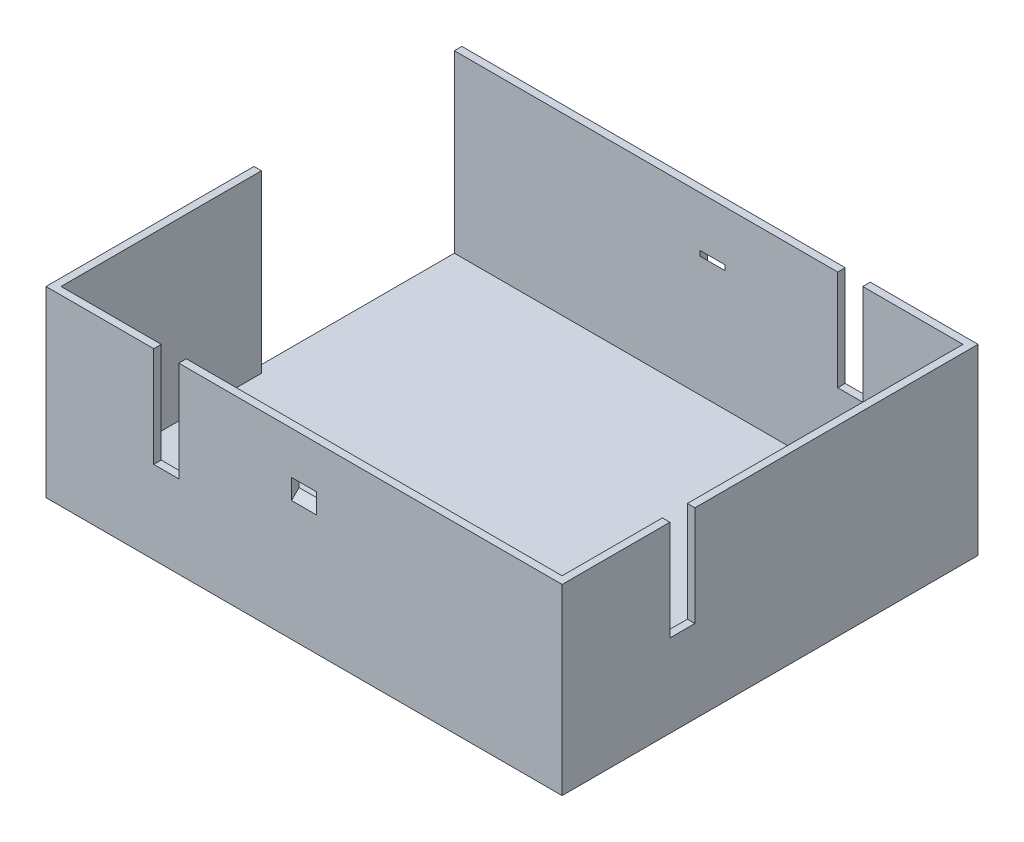
ISO-10303-21;
HEADER;
FILE_DESCRIPTION(('STEP AP214'),'2;1');
FILE_NAME('part.step','',(''),(''),'','','');
FILE_SCHEMA(('AUTOMOTIVE_DESIGN { 1 0 10303 214 1 1 1 1 }'));
ENDSEC;
DATA;
#1=APPLICATION_CONTEXT('core data for automotive mechanical design processes');
#2=APPLICATION_PROTOCOL_DEFINITION('international standard','automotive_design',2000,#1);
#3=PRODUCT_CONTEXT('',#1,'mechanical');
#4=PRODUCT('Part','Part','',(#3));
#5=PRODUCT_RELATED_PRODUCT_CATEGORY('part','',(#4));
#6=PRODUCT_DEFINITION_FORMATION('','',#4);
#7=PRODUCT_DEFINITION_CONTEXT('part definition',#1,'design');
#8=PRODUCT_DEFINITION('design','',#6,#7);
#9=PRODUCT_DEFINITION_SHAPE('','',#8);
#10=(LENGTH_UNIT() NAMED_UNIT(*) SI_UNIT(.MILLI.,.METRE.));
#11=(NAMED_UNIT(*) PLANE_ANGLE_UNIT() SI_UNIT($,.RADIAN.));
#12=(NAMED_UNIT(*) SI_UNIT($,.STERADIAN.) SOLID_ANGLE_UNIT());
#13=UNCERTAINTY_MEASURE_WITH_UNIT(LENGTH_MEASURE(1.E-05),#10,'distance_accuracy_value','');
#14=(GEOMETRIC_REPRESENTATION_CONTEXT(3) GLOBAL_UNCERTAINTY_ASSIGNED_CONTEXT((#13)) GLOBAL_UNIT_ASSIGNED_CONTEXT((#10,
#11,#12)) REPRESENTATION_CONTEXT('',''));
#15=CARTESIAN_POINT('',(0.,0.,0.));
#16=DIRECTION('',(0.,0.,1.));
#17=DIRECTION('',(1.,0.,0.));
#18=AXIS2_PLACEMENT_3D('',#15,#16,#17);
#19=CARTESIAN_POINT('',(0.,36.5,0.));
#20=DIRECTION('',(0.,1.,0.));
#21=DIRECTION('',(0.,0.,1.));
#22=AXIS2_PLACEMENT_3D('',#19,#20,#21);
#23=PLANE('',#22);
#24=DIRECTION('',(0.,0.,-1.));
#25=VECTOR('',#24,1.);
#26=CARTESIAN_POINT('',(53.0283018867924,36.5,0.));
#27=LINE('',#26,#25);
#28=CARTESIAN_POINT('',(53.0283018867924,36.5,-10.1745283018868));
#29=VERTEX_POINT('',#28);
#30=CARTESIAN_POINT('',(53.0283018867924,36.5,-11.6745283018868));
#31=VERTEX_POINT('',#30);
#32=EDGE_CURVE('E40',#29,#31,#27,.T.);
#33=ORIENTED_EDGE('',*,*,#32,.F.);
#34=DIRECTION('',(-1.,0.,0.));
#35=VECTOR('',#34,1.);
#36=CARTESIAN_POINT('',(-26.9716981132075,36.5,-10.1745283018868));
#37=LINE('',#36,#35);
#38=CARTESIAN_POINT('',(73.0283018867924,36.5,-10.1745283018868));
#39=VERTEX_POINT('',#38);
#40=EDGE_CURVE('E395',#39,#29,#37,.T.);
#41=ORIENTED_EDGE('',*,*,#40,.F.);
#42=DIRECTION('',(0.,0.,-1.));
#43=VECTOR('',#42,1.);
#44=CARTESIAN_POINT('',(73.0283018867924,36.5,-10.1745283018868));
#45=LINE('',#44,#43);
#46=CARTESIAN_POINT('',(73.0283018867924,36.5,44.8254716981132));
#47=VERTEX_POINT('',#46);
#48=EDGE_CURVE('E405',#47,#39,#45,.T.);
#49=ORIENTED_EDGE('',*,*,#48,.F.);
#50=DIRECTION('',(1.,0.,0.));
#51=VECTOR('',#50,1.);
#52=CARTESIAN_POINT('',(73.0283018867924,36.5,44.8254716981132));
#53=LINE('',#52,#51);
#54=CARTESIAN_POINT('',(74.5283018867924,36.5,44.8254716981132));
#55=VERTEX_POINT('',#54);
#56=EDGE_CURVE('E347',#47,#55,#53,.T.);
#57=ORIENTED_EDGE('',*,*,#56,.T.);
#58=DIRECTION('',(0.,0.,-1.));
#59=VECTOR('',#58,1.);
#60=CARTESIAN_POINT('',(74.5283018867924,36.5,-11.6745283018868));
#61=LINE('',#60,#59);
#62=CARTESIAN_POINT('',(74.5283018867924,36.5,-11.6745283018868));
#63=VERTEX_POINT('',#62);
#64=EDGE_CURVE('E433',#55,#63,#61,.T.);
#65=ORIENTED_EDGE('',*,*,#64,.T.);
#66=DIRECTION('',(-1.,0.,0.));
#67=VECTOR('',#66,1.);
#68=CARTESIAN_POINT('',(-28.4716981132075,36.5,-11.6745283018868));
#69=LINE('',#68,#67);
#70=EDGE_CURVE('E438',#63,#31,#69,.T.);
#71=ORIENTED_EDGE('',*,*,#70,.T.);
#72=EDGE_LOOP('',(#33,#41,#49,#57,#65,#71));
#73=FACE_BOUND('',#72,.T.);
#74=ADVANCED_FACE('F32',(#73),#23,.T.);
#75=CARTESIAN_POINT('',(-28.4716981132075,1.5,-11.6745283018868));
#76=DIRECTION('',(0.,0.,1.));
#77=DIRECTION('',(1.,0.,0.));
#78=AXIS2_PLACEMENT_3D('',#75,#76,#77);
#79=PLANE('',#78);
#80=DIRECTION('',(-1.,0.,0.));
#81=VECTOR('',#80,1.);
#82=CARTESIAN_POINT('',(53.0283018867924,16.5,-11.6745283018868));
#83=LINE('',#82,#81);
#84=CARTESIAN_POINT('',(53.0283018867924,16.5,-11.6745283018868));
#85=VERTEX_POINT('',#84);
#86=CARTESIAN_POINT('',(48.0283018867925,16.5,-11.6745283018868));
#87=VERTEX_POINT('',#86);
#88=EDGE_CURVE('E234',#85,#87,#83,.T.);
#89=ORIENTED_EDGE('',*,*,#88,.F.);
#90=DIRECTION('',(0.,-1.,0.));
#91=VECTOR('',#90,1.);
#92=CARTESIAN_POINT('',(53.0283018867924,36.5,-11.6745283018868));
#93=LINE('',#92,#91);
#94=EDGE_CURVE('E241',#31,#85,#93,.T.);
#95=ORIENTED_EDGE('',*,*,#94,.F.);
#96=ORIENTED_EDGE('',*,*,#70,.F.);
#97=DIRECTION('',(0.,-1.,0.));
#98=VECTOR('',#97,1.);
#99=CARTESIAN_POINT('',(74.5283018867924,1.5,-11.6745283018868));
#100=LINE('',#99,#98);
#101=CARTESIAN_POINT('',(74.5283018867924,0.,-11.6745283018868));
#102=VERTEX_POINT('',#101);
#103=EDGE_CURVE('E452',#63,#102,#100,.T.);
#104=ORIENTED_EDGE('',*,*,#103,.T.);
#105=DIRECTION('',(-1.,0.,0.));
#106=VECTOR('',#105,1.);
#107=CARTESIAN_POINT('',(-28.4716981132075,0.,-11.6745283018868));
#108=LINE('',#107,#106);
#109=CARTESIAN_POINT('',(-28.4716981132075,0.,-11.6745283018868));
#110=VERTEX_POINT('',#109);
#111=EDGE_CURVE('E447',#102,#110,#108,.T.);
#112=ORIENTED_EDGE('',*,*,#111,.T.);
#113=DIRECTION('',(0.,-1.,0.));
#114=VECTOR('',#113,1.);
#115=CARTESIAN_POINT('',(-28.4716981132075,1.5,-11.6745283018868));
#116=LINE('',#115,#114);
#117=CARTESIAN_POINT('',(-28.4716981132075,36.5,-11.6745283018868));
#118=VERTEX_POINT('',#117);
#119=EDGE_CURVE('E449',#118,#110,#116,.T.);
#120=ORIENTED_EDGE('',*,*,#119,.F.);
#121=CARTESIAN_POINT('',(48.0283018867924,36.5,-11.6745283018868));
#122=VERTEX_POINT('',#121);
#123=EDGE_CURVE('E437',#122,#118,#69,.T.);
#124=ORIENTED_EDGE('',*,*,#123,.F.);
#125=DIRECTION('',(0.,1.,0.));
#126=VECTOR('',#125,1.);
#127=CARTESIAN_POINT('',(48.0283018867924,36.5,-11.6745283018868));
#128=LINE('',#127,#126);
#129=EDGE_CURVE('E47',#87,#122,#128,.T.);
#130=ORIENTED_EDGE('',*,*,#129,.F.);
#131=EDGE_LOOP('',(#89,#95,#96,#104,#112,#120,#124,#130));
#132=FACE_BOUND('',#131,.T.);
#133=DIRECTION('',(0.,1.,0.));
#134=VECTOR('',#133,1.);
#135=CARTESIAN_POINT('',(20.5283018867925,28.,-11.6745283018868));
#136=LINE('',#135,#134);
#137=CARTESIAN_POINT('',(20.5283018867925,24.,-11.6745283018868));
#138=VERTEX_POINT('',#137);
#139=CARTESIAN_POINT('',(20.5283018867925,28.,-11.6745283018868));
#140=VERTEX_POINT('',#139);
#141=EDGE_CURVE('E269',#138,#140,#136,.T.);
#142=ORIENTED_EDGE('',*,*,#141,.F.);
#143=DIRECTION('',(1.,0.,0.));
#144=VECTOR('',#143,1.);
#145=CARTESIAN_POINT('',(20.5283018867925,24.,-11.6745283018868));
#146=LINE('',#145,#144);
#147=CARTESIAN_POINT('',(25.5283018867925,24.,-11.6745283018868));
#148=VERTEX_POINT('',#147);
#149=EDGE_CURVE('E284',#138,#148,#146,.T.);
#150=ORIENTED_EDGE('',*,*,#149,.T.);
#151=DIRECTION('',(0.,1.,0.));
#152=VECTOR('',#151,1.);
#153=CARTESIAN_POINT('',(25.5283018867925,28.,-11.6745283018868));
#154=LINE('',#153,#152);
#155=CARTESIAN_POINT('',(25.5283018867924,28.,-11.6745283018868));
#156=VERTEX_POINT('',#155);
#157=EDGE_CURVE('E263',#148,#156,#154,.T.);
#158=ORIENTED_EDGE('',*,*,#157,.T.);
#159=DIRECTION('',(1.,0.,0.));
#160=VECTOR('',#159,1.);
#161=CARTESIAN_POINT('',(20.5283018867925,28.,-11.6745283018868));
#162=LINE('',#161,#160);
#163=EDGE_CURVE('E281',#140,#156,#162,.T.);
#164=ORIENTED_EDGE('',*,*,#163,.F.);
#165=EDGE_LOOP('',(#142,#150,#158,#164));
#166=FACE_BOUND('',#165,.T.);
#167=ADVANCED_FACE('F248',(#132,#166),#79,.F.);
#168=CARTESIAN_POINT('',(-26.9716981132075,36.5,-10.1745283018868));
#169=DIRECTION('',(0.,0.,1.));
#170=DIRECTION('',(1.,0.,0.));
#171=AXIS2_PLACEMENT_3D('',#168,#169,#170);
#172=PLANE('',#171);
#173=DIRECTION('',(0.,1.,0.));
#174=VECTOR('',#173,1.);
#175=CARTESIAN_POINT('',(53.0283018867924,36.5,-10.1745283018868));
#176=LINE('',#175,#174);
#177=CARTESIAN_POINT('',(53.0283018867924,16.5,-10.1745283018868));
#178=VERTEX_POINT('',#177);
#179=EDGE_CURVE('E257',#178,#29,#176,.T.);
#180=ORIENTED_EDGE('',*,*,#179,.F.);
#181=DIRECTION('',(1.,0.,0.));
#182=VECTOR('',#181,1.);
#183=CARTESIAN_POINT('',(-26.9716981132075,16.5,-10.1745283018868));
#184=LINE('',#183,#182);
#185=CARTESIAN_POINT('',(48.0283018867925,16.5,-10.1745283018868));
#186=VERTEX_POINT('',#185);
#187=EDGE_CURVE('E11',#186,#178,#184,.T.);
#188=ORIENTED_EDGE('',*,*,#187,.F.);
#189=DIRECTION('',(0.,-1.,0.));
#190=VECTOR('',#189,1.);
#191=CARTESIAN_POINT('',(48.0283018867924,36.5,-10.1745283018868));
#192=LINE('',#191,#190);
#193=CARTESIAN_POINT('',(48.0283018867924,36.5,-10.1745283018868));
#194=VERTEX_POINT('',#193);
#195=EDGE_CURVE('E254',#194,#186,#192,.T.);
#196=ORIENTED_EDGE('',*,*,#195,.F.);
#197=CARTESIAN_POINT('',(-28.4716981132075,36.5,-10.1745283018868));
#198=VERTEX_POINT('',#197);
#199=EDGE_CURVE('E399',#194,#198,#37,.T.);
#200=ORIENTED_EDGE('',*,*,#199,.T.);
#201=DIRECTION('',(0.,-1.,0.));
#202=VECTOR('',#201,1.);
#203=CARTESIAN_POINT('',(-28.4716981132075,36.5,-10.1745283018868));
#204=LINE('',#203,#202);
#205=CARTESIAN_POINT('',(-28.4716981132075,1.5,-10.1745283018868));
#206=VERTEX_POINT('',#205);
#207=EDGE_CURVE('E372',#198,#206,#204,.T.);
#208=ORIENTED_EDGE('',*,*,#207,.T.);
#209=DIRECTION('',(-1.,0.,0.));
#210=VECTOR('',#209,1.);
#211=CARTESIAN_POINT('',(-26.9716981132075,1.5,-10.1745283018868));
#212=LINE('',#211,#210);
#213=CARTESIAN_POINT('',(73.0283018867924,1.5,-10.1745283018868));
#214=VERTEX_POINT('',#213);
#215=EDGE_CURVE('E393',#214,#206,#212,.T.);
#216=ORIENTED_EDGE('',*,*,#215,.F.);
#217=DIRECTION('',(0.,-1.,0.));
#218=VECTOR('',#217,1.);
#219=CARTESIAN_POINT('',(73.0283018867924,36.5,-10.1745283018868));
#220=LINE('',#219,#218);
#221=EDGE_CURVE('E409',#39,#214,#220,.T.);
#222=ORIENTED_EDGE('',*,*,#221,.F.);
#223=ORIENTED_EDGE('',*,*,#40,.T.);
#224=EDGE_LOOP('',(#180,#188,#196,#200,#208,#216,#222,#223));
#225=FACE_BOUND('',#224,.T.);
#226=DIRECTION('',(1.,0.,0.));
#227=VECTOR('',#226,1.);
#228=CARTESIAN_POINT('',(20.5283018867925,25.5,-10.1745283018868));
#229=LINE('',#228,#227);
#230=CARTESIAN_POINT('',(20.5283018867925,25.5,-10.1745283018868));
#231=VERTEX_POINT('',#230);
#232=CARTESIAN_POINT('',(25.5283018867924,25.5,-10.1745283018868));
#233=VERTEX_POINT('',#232);
#234=EDGE_CURVE('E287',#231,#233,#229,.T.);
#235=ORIENTED_EDGE('',*,*,#234,.F.);
#236=DIRECTION('',(0.,-1.,0.));
#237=VECTOR('',#236,1.);
#238=CARTESIAN_POINT('',(20.5283018867925,26.5,-10.1745283018868));
#239=LINE('',#238,#237);
#240=CARTESIAN_POINT('',(20.5283018867925,26.5,-10.1745283018868));
#241=VERTEX_POINT('',#240);
#242=EDGE_CURVE('E262',#241,#231,#239,.T.);
#243=ORIENTED_EDGE('',*,*,#242,.F.);
#244=DIRECTION('',(1.,0.,0.));
#245=VECTOR('',#244,1.);
#246=CARTESIAN_POINT('',(20.5283018867925,26.5,-10.1745283018868));
#247=LINE('',#246,#245);
#248=CARTESIAN_POINT('',(25.5283018867925,26.5,-10.1745283018868));
#249=VERTEX_POINT('',#248);
#250=EDGE_CURVE('E272',#241,#249,#247,.T.);
#251=ORIENTED_EDGE('',*,*,#250,.T.);
#252=DIRECTION('',(0.,-1.,0.));
#253=VECTOR('',#252,1.);
#254=CARTESIAN_POINT('',(25.5283018867925,26.5,-10.1745283018868));
#255=LINE('',#254,#253);
#256=EDGE_CURVE('E274',#249,#233,#255,.T.);
#257=ORIENTED_EDGE('',*,*,#256,.T.);
#258=EDGE_LOOP('',(#235,#243,#251,#257));
#259=FACE_BOUND('',#258,.T.);
#260=ADVANCED_FACE('F467',(#225,#259),#172,.T.);
#261=DIRECTION('',(1.,0.,0.));
#262=VECTOR('',#261,1.);
#263=CARTESIAN_POINT('',(73.0283018867924,36.5,49.8254716981132));
#264=LINE('',#263,#262);
#265=CARTESIAN_POINT('',(73.0283018867924,36.5,49.8254716981132));
#266=VERTEX_POINT('',#265);
#267=CARTESIAN_POINT('',(74.5283018867924,36.5,49.8254716981132));
#268=VERTEX_POINT('',#267);
#269=EDGE_CURVE('E344',#266,#268,#264,.T.);
#270=ORIENTED_EDGE('',*,*,#269,.F.);
#271=CARTESIAN_POINT('',(73.0283018867924,36.5,69.8254716981132));
#272=VERTEX_POINT('',#271);
#273=EDGE_CURVE('E406',#272,#266,#45,.T.);
#274=ORIENTED_EDGE('',*,*,#273,.F.);
#275=DIRECTION('',(1.,0.,0.));
#276=VECTOR('',#275,1.);
#277=CARTESIAN_POINT('',(-26.9716981132075,36.5,69.8254716981132));
#278=LINE('',#277,#276);
#279=CARTESIAN_POINT('',(-1.97169811320754,36.5,69.8254716981132));
#280=VERTEX_POINT('',#279);
#281=EDGE_CURVE('E401',#280,#272,#278,.T.);
#282=ORIENTED_EDGE('',*,*,#281,.F.);
#283=DIRECTION('',(0.,0.,1.));
#284=VECTOR('',#283,1.);
#285=CARTESIAN_POINT('',(-1.97169811320754,36.5,69.8254716981132));
#286=LINE('',#285,#284);
#287=CARTESIAN_POINT('',(-1.97169811320754,36.5,71.3254716981132));
#288=VERTEX_POINT('',#287);
#289=EDGE_CURVE('E373',#280,#288,#286,.T.);
#290=ORIENTED_EDGE('',*,*,#289,.T.);
#291=DIRECTION('',(1.,0.,0.));
#292=VECTOR('',#291,1.);
#293=CARTESIAN_POINT('',(-28.4716981132075,36.5,71.3254716981132));
#294=LINE('',#293,#292);
#295=CARTESIAN_POINT('',(74.5283018867924,36.5,71.3254716981132));
#296=VERTEX_POINT('',#295);
#297=EDGE_CURVE('E429',#288,#296,#294,.T.);
#298=ORIENTED_EDGE('',*,*,#297,.T.);
#299=EDGE_CURVE('E434',#296,#268,#61,.T.);
#300=ORIENTED_EDGE('',*,*,#299,.T.);
#301=EDGE_LOOP('',(#270,#274,#282,#290,#298,#300));
#302=FACE_BOUND('',#301,.T.);
#303=ADVANCED_FACE('F521',(#302),#23,.T.);
#304=DIRECTION('',(0.,0.,1.));
#305=VECTOR('',#304,1.);
#306=CARTESIAN_POINT('',(-6.97169811320754,36.5,69.8254716981132));
#307=LINE('',#306,#305);
#308=CARTESIAN_POINT('',(-6.97169811320754,36.5,69.8254716981132));
#309=VERTEX_POINT('',#308);
#310=CARTESIAN_POINT('',(-6.97169811320754,36.5,71.3254716981132));
#311=VERTEX_POINT('',#310);
#312=EDGE_CURVE('E370',#309,#311,#307,.T.);
#313=ORIENTED_EDGE('',*,*,#312,.F.);
#314=CARTESIAN_POINT('',(-26.9716981132075,36.5,69.8254716981132));
#315=VERTEX_POINT('',#314);
#316=EDGE_CURVE('E402',#315,#309,#278,.T.);
#317=ORIENTED_EDGE('',*,*,#316,.F.);
#318=DIRECTION('',(0.,0.,1.));
#319=VECTOR('',#318,1.);
#320=CARTESIAN_POINT('',(-26.9716981132075,36.5,-10.1745283018868));
#321=LINE('',#320,#319);
#322=CARTESIAN_POINT('',(-26.9716981132075,36.5,29.8254716981132));
#323=VERTEX_POINT('',#322);
#324=EDGE_CURVE('E398',#323,#315,#321,.T.);
#325=ORIENTED_EDGE('',*,*,#324,.F.);
#326=DIRECTION('',(-1.,0.,0.));
#327=VECTOR('',#326,1.);
#328=CARTESIAN_POINT('',(-26.9716981132075,36.5,29.8254716981132));
#329=LINE('',#328,#327);
#330=CARTESIAN_POINT('',(-28.4716981132075,36.5,29.8254716981132));
#331=VERTEX_POINT('',#330);
#332=EDGE_CURVE('E390',#323,#331,#329,.T.);
#333=ORIENTED_EDGE('',*,*,#332,.T.);
#334=DIRECTION('',(0.,0.,1.));
#335=VECTOR('',#334,1.);
#336=CARTESIAN_POINT('',(-28.4716981132075,36.5,-11.6745283018868));
#337=LINE('',#336,#335);
#338=CARTESIAN_POINT('',(-28.4716981132075,36.5,71.3254716981132));
#339=VERTEX_POINT('',#338);
#340=EDGE_CURVE('E425',#331,#339,#337,.T.);
#341=ORIENTED_EDGE('',*,*,#340,.T.);
#342=EDGE_CURVE('E430',#339,#311,#294,.T.);
#343=ORIENTED_EDGE('',*,*,#342,.T.);
#344=EDGE_LOOP('',(#313,#317,#325,#333,#341,#343));
#345=FACE_BOUND('',#344,.T.);
#346=ADVANCED_FACE('F503',(#345),#23,.T.);
#347=CARTESIAN_POINT('',(-28.4716981132075,1.5,-11.6745283018868));
#348=DIRECTION('',(1.,0.,0.));
#349=DIRECTION('',(0.,0.,-1.));
#350=AXIS2_PLACEMENT_3D('',#347,#348,#349);
#351=PLANE('',#350);
#352=DIRECTION('',(0.,0.,1.));
#353=VECTOR('',#352,1.);
#354=CARTESIAN_POINT('',(-28.4716981132075,1.5,-10.1745283018868));
#355=LINE('',#354,#353);
#356=CARTESIAN_POINT('',(-28.4716981132075,1.5,29.8254716981132));
#357=VERTEX_POINT('',#356);
#358=EDGE_CURVE('E386',#206,#357,#355,.T.);
#359=ORIENTED_EDGE('',*,*,#358,.F.);
#360=ORIENTED_EDGE('',*,*,#207,.F.);
#361=EDGE_CURVE('E426',#118,#198,#337,.T.);
#362=ORIENTED_EDGE('',*,*,#361,.F.);
#363=ORIENTED_EDGE('',*,*,#119,.T.);
#364=DIRECTION('',(0.,0.,1.));
#365=VECTOR('',#364,1.);
#366=CARTESIAN_POINT('',(-28.4716981132075,0.,-11.6745283018868));
#367=LINE('',#366,#365);
#368=CARTESIAN_POINT('',(-28.4716981132075,0.,71.3254716981132));
#369=VERTEX_POINT('',#368);
#370=EDGE_CURVE('E440',#110,#369,#367,.T.);
#371=ORIENTED_EDGE('',*,*,#370,.T.);
#372=DIRECTION('',(0.,-1.,0.));
#373=VECTOR('',#372,1.);
#374=CARTESIAN_POINT('',(-28.4716981132075,1.5,71.3254716981132));
#375=LINE('',#374,#373);
#376=EDGE_CURVE('E458',#339,#369,#375,.T.);
#377=ORIENTED_EDGE('',*,*,#376,.F.);
#378=ORIENTED_EDGE('',*,*,#340,.F.);
#379=DIRECTION('',(0.,1.,0.));
#380=VECTOR('',#379,1.);
#381=CARTESIAN_POINT('',(-28.4716981132075,36.5,29.8254716981132));
#382=LINE('',#381,#380);
#383=EDGE_CURVE('E383',#357,#331,#382,.T.);
#384=ORIENTED_EDGE('',*,*,#383,.F.);
#385=EDGE_LOOP('',(#359,#360,#362,#363,#371,#377,#378,#384));
#386=FACE_BOUND('',#385,.T.);
#387=ADVANCED_FACE('F34',(#386),#351,.F.);
#388=CARTESIAN_POINT('',(-28.4716981132075,1.5,71.3254716981132));
#389=DIRECTION('',(0.,0.,-1.));
#390=DIRECTION('',(-1.,0.,0.));
#391=AXIS2_PLACEMENT_3D('',#388,#389,#390);
#392=PLANE('',#391);
#393=DIRECTION('',(1.,0.,0.));
#394=VECTOR('',#393,1.);
#395=CARTESIAN_POINT('',(20.5283018867925,24.,71.3254716981132));
#396=LINE('',#395,#394);
#397=CARTESIAN_POINT('',(20.5283018867925,24.,71.3254716981132));
#398=VERTEX_POINT('',#397);
#399=CARTESIAN_POINT('',(25.5283018867925,24.,71.3254716981132));
#400=VERTEX_POINT('',#399);
#401=EDGE_CURVE('E304',#398,#400,#396,.T.);
#402=ORIENTED_EDGE('',*,*,#401,.F.);
#403=DIRECTION('',(0.,-1.,0.));
#404=VECTOR('',#403,1.);
#405=CARTESIAN_POINT('',(20.5283018867925,28.,71.3254716981132));
#406=LINE('',#405,#404);
#407=CARTESIAN_POINT('',(20.5283018867925,28.,71.3254716981132));
#408=VERTEX_POINT('',#407);
#409=EDGE_CURVE('E292',#408,#398,#406,.T.);
#410=ORIENTED_EDGE('',*,*,#409,.F.);
#411=DIRECTION('',(1.,0.,0.));
#412=VECTOR('',#411,1.);
#413=CARTESIAN_POINT('',(20.5283018867925,28.,71.3254716981132));
#414=LINE('',#413,#412);
#415=CARTESIAN_POINT('',(25.5283018867925,28.,71.3254716981132));
#416=VERTEX_POINT('',#415);
#417=EDGE_CURVE('E315',#408,#416,#414,.T.);
#418=ORIENTED_EDGE('',*,*,#417,.T.);
#419=DIRECTION('',(0.,-1.,0.));
#420=VECTOR('',#419,1.);
#421=CARTESIAN_POINT('',(25.5283018867925,28.,71.3254716981132));
#422=LINE('',#421,#420);
#423=EDGE_CURVE('E283',#416,#400,#422,.T.);
#424=ORIENTED_EDGE('',*,*,#423,.T.);
#425=EDGE_LOOP('',(#402,#410,#418,#424));
#426=FACE_BOUND('',#425,.T.);
#427=DIRECTION('',(1.,0.,0.));
#428=VECTOR('',#427,1.);
#429=CARTESIAN_POINT('',(-6.97169811320754,16.5,71.3254716981132));
#430=LINE('',#429,#428);
#431=CARTESIAN_POINT('',(-6.97169811320754,16.5,71.3254716981132));
#432=VERTEX_POINT('',#431);
#433=CARTESIAN_POINT('',(-1.97169811320754,16.5,71.3254716981132));
#434=VERTEX_POINT('',#433);
#435=EDGE_CURVE('E366',#432,#434,#430,.T.);
#436=ORIENTED_EDGE('',*,*,#435,.F.);
#437=DIRECTION('',(0.,-1.,0.));
#438=VECTOR('',#437,1.);
#439=CARTESIAN_POINT('',(-6.97169811320754,36.5,71.3254716981132));
#440=LINE('',#439,#438);
#441=EDGE_CURVE('E346',#311,#432,#440,.T.);
#442=ORIENTED_EDGE('',*,*,#441,.F.);
#443=ORIENTED_EDGE('',*,*,#342,.F.);
#444=ORIENTED_EDGE('',*,*,#376,.T.);
#445=DIRECTION('',(1.,0.,0.));
#446=VECTOR('',#445,1.);
#447=CARTESIAN_POINT('',(-28.4716981132075,0.,71.3254716981132));
#448=LINE('',#447,#446);
#449=CARTESIAN_POINT('',(74.5283018867924,0.,71.3254716981132));
#450=VERTEX_POINT('',#449);
#451=EDGE_CURVE('E443',#369,#450,#448,.T.);
#452=ORIENTED_EDGE('',*,*,#451,.T.);
#453=DIRECTION('',(0.,-1.,0.));
#454=VECTOR('',#453,1.);
#455=CARTESIAN_POINT('',(74.5283018867924,1.5,71.3254716981132));
#456=LINE('',#455,#454);
#457=EDGE_CURVE('E455',#296,#450,#456,.T.);
#458=ORIENTED_EDGE('',*,*,#457,.F.);
#459=ORIENTED_EDGE('',*,*,#297,.F.);
#460=DIRECTION('',(0.,1.,0.));
#461=VECTOR('',#460,1.);
#462=CARTESIAN_POINT('',(-1.97169811320754,36.5,71.3254716981132));
#463=LINE('',#462,#461);
#464=EDGE_CURVE('E357',#434,#288,#463,.T.);
#465=ORIENTED_EDGE('',*,*,#464,.F.);
#466=EDGE_LOOP('',(#436,#442,#443,#444,#452,#458,#459,#465));
#467=FACE_BOUND('',#466,.T.);
#468=ADVANCED_FACE('F500',(#426,#467),#392,.F.);
#469=CARTESIAN_POINT('',(74.5283018867924,1.5,-11.6745283018868));
#470=DIRECTION('',(-1.,0.,0.));
#471=DIRECTION('',(0.,0.,1.));
#472=AXIS2_PLACEMENT_3D('',#469,#470,#471);
#473=PLANE('',#472);
#474=DIRECTION('',(0.,0.,-1.));
#475=VECTOR('',#474,1.);
#476=CARTESIAN_POINT('',(74.5283018867924,16.5,49.8254716981132));
#477=LINE('',#476,#475);
#478=CARTESIAN_POINT('',(74.5283018867924,16.5,49.8254716981132));
#479=VERTEX_POINT('',#478);
#480=CARTESIAN_POINT('',(74.5283018867924,16.5,44.8254716981132));
#481=VERTEX_POINT('',#480);
#482=EDGE_CURVE('E340',#479,#481,#477,.T.);
#483=ORIENTED_EDGE('',*,*,#482,.F.);
#484=DIRECTION('',(0.,-1.,0.));
#485=VECTOR('',#484,1.);
#486=CARTESIAN_POINT('',(74.5283018867924,36.5,49.8254716981132));
#487=LINE('',#486,#485);
#488=EDGE_CURVE('E318',#268,#479,#487,.T.);
#489=ORIENTED_EDGE('',*,*,#488,.F.);
#490=ORIENTED_EDGE('',*,*,#299,.F.);
#491=ORIENTED_EDGE('',*,*,#457,.T.);
#492=DIRECTION('',(0.,0.,-1.));
#493=VECTOR('',#492,1.);
#494=CARTESIAN_POINT('',(74.5283018867924,0.,-11.6745283018868));
#495=LINE('',#494,#493);
#496=EDGE_CURVE('E445',#450,#102,#495,.T.);
#497=ORIENTED_EDGE('',*,*,#496,.T.);
#498=ORIENTED_EDGE('',*,*,#103,.F.);
#499=ORIENTED_EDGE('',*,*,#64,.F.);
#500=DIRECTION('',(0.,1.,0.));
#501=VECTOR('',#500,1.);
#502=CARTESIAN_POINT('',(74.5283018867924,36.5,44.8254716981132));
#503=LINE('',#502,#501);
#504=EDGE_CURVE('E331',#481,#55,#503,.T.);
#505=ORIENTED_EDGE('',*,*,#504,.F.);
#506=EDGE_LOOP('',(#483,#489,#490,#491,#497,#498,#499,#505));
#507=FACE_BOUND('',#506,.T.);
#508=ADVANCED_FACE('F527',(#507),#473,.F.);
#509=CARTESIAN_POINT('',(0.,0.,0.));
#510=DIRECTION('',(0.,1.,0.));
#511=DIRECTION('',(0.,0.,1.));
#512=AXIS2_PLACEMENT_3D('',#509,#510,#511);
#513=PLANE('',#512);
#514=ORIENTED_EDGE('',*,*,#370,.F.);
#515=ORIENTED_EDGE('',*,*,#111,.F.);
#516=ORIENTED_EDGE('',*,*,#496,.F.);
#517=ORIENTED_EDGE('',*,*,#451,.F.);
#518=EDGE_LOOP('',(#514,#515,#516,#517));
#519=FACE_BOUND('',#518,.T.);
#520=ADVANCED_FACE('F493',(#519),#513,.F.);
#521=DIRECTION('',(0.,0.,1.));
#522=VECTOR('',#521,1.);
#523=CARTESIAN_POINT('',(48.0283018867924,36.5,0.));
#524=LINE('',#523,#522);
#525=EDGE_CURVE('E461',#122,#194,#524,.T.);
#526=ORIENTED_EDGE('',*,*,#525,.F.);
#527=ORIENTED_EDGE('',*,*,#123,.T.);
#528=ORIENTED_EDGE('',*,*,#361,.T.);
#529=ORIENTED_EDGE('',*,*,#199,.F.);
#530=EDGE_LOOP('',(#526,#527,#528,#529));
#531=FACE_BOUND('',#530,.T.);
#532=ADVANCED_FACE('F470',(#531),#23,.T.);
#533=CARTESIAN_POINT('',(-26.9716981132075,36.5,-10.1745283018868));
#534=DIRECTION('',(1.,0.,0.));
#535=DIRECTION('',(0.,0.,-1.));
#536=AXIS2_PLACEMENT_3D('',#533,#534,#535);
#537=PLANE('',#536);
#538=DIRECTION('',(0.,1.,0.));
#539=VECTOR('',#538,1.);
#540=CARTESIAN_POINT('',(-26.9716981132075,36.5,29.8254716981132));
#541=LINE('',#540,#539);
#542=CARTESIAN_POINT('',(-26.9716981132075,1.5,29.8254716981132));
#543=VERTEX_POINT('',#542);
#544=EDGE_CURVE('E379',#543,#323,#541,.T.);
#545=ORIENTED_EDGE('',*,*,#544,.T.);
#546=ORIENTED_EDGE('',*,*,#324,.T.);
#547=DIRECTION('',(0.,-1.,0.));
#548=VECTOR('',#547,1.);
#549=CARTESIAN_POINT('',(-26.9716981132075,36.5,69.8254716981132));
#550=LINE('',#549,#548);
#551=CARTESIAN_POINT('',(-26.9716981132075,1.5,69.8254716981132));
#552=VERTEX_POINT('',#551);
#553=EDGE_CURVE('E422',#315,#552,#550,.T.);
#554=ORIENTED_EDGE('',*,*,#553,.T.);
#555=DIRECTION('',(0.,0.,1.));
#556=VECTOR('',#555,1.);
#557=CARTESIAN_POINT('',(-26.9716981132075,1.5,-10.1745283018868));
#558=LINE('',#557,#556);
#559=EDGE_CURVE('E411',#543,#552,#558,.T.);
#560=ORIENTED_EDGE('',*,*,#559,.F.);
#561=EDGE_LOOP('',(#545,#546,#554,#560));
#562=FACE_BOUND('',#561,.T.);
#563=ADVANCED_FACE('F511',(#562),#537,.T.);
#564=CARTESIAN_POINT('',(-26.9716981132075,36.5,69.8254716981132));
#565=DIRECTION('',(0.,0.,-1.));
#566=DIRECTION('',(-1.,0.,0.));
#567=AXIS2_PLACEMENT_3D('',#564,#565,#566);
#568=PLANE('',#567);
#569=DIRECTION('',(0.,1.,0.));
#570=VECTOR('',#569,1.);
#571=CARTESIAN_POINT('',(20.5283018867925,26.5,69.8254716981132));
#572=LINE('',#571,#570);
#573=CARTESIAN_POINT('',(20.5283018867925,25.5,69.8254716981132));
#574=VERTEX_POINT('',#573);
#575=CARTESIAN_POINT('',(20.5283018867925,26.5,69.8254716981132));
#576=VERTEX_POINT('',#575);
#577=EDGE_CURVE('E299',#574,#576,#572,.T.);
#578=ORIENTED_EDGE('',*,*,#577,.F.);
#579=DIRECTION('',(1.,0.,0.));
#580=VECTOR('',#579,1.);
#581=CARTESIAN_POINT('',(20.5283018867925,25.5,69.8254716981132));
#582=LINE('',#581,#580);
#583=CARTESIAN_POINT('',(25.5283018867925,25.5,69.8254716981132));
#584=VERTEX_POINT('',#583);
#585=EDGE_CURVE('E322',#574,#584,#582,.T.);
#586=ORIENTED_EDGE('',*,*,#585,.T.);
#587=DIRECTION('',(0.,1.,0.));
#588=VECTOR('',#587,1.);
#589=CARTESIAN_POINT('',(25.5283018867925,26.5,69.8254716981132));
#590=LINE('',#589,#588);
#591=CARTESIAN_POINT('',(25.5283018867924,26.5,69.8254716981132));
#592=VERTEX_POINT('',#591);
#593=EDGE_CURVE('E310',#584,#592,#590,.T.);
#594=ORIENTED_EDGE('',*,*,#593,.T.);
#595=DIRECTION('',(1.,0.,0.));
#596=VECTOR('',#595,1.);
#597=CARTESIAN_POINT('',(20.5283018867925,26.5,69.8254716981132));
#598=LINE('',#597,#596);
#599=EDGE_CURVE('E319',#576,#592,#598,.T.);
#600=ORIENTED_EDGE('',*,*,#599,.F.);
#601=EDGE_LOOP('',(#578,#586,#594,#600));
#602=FACE_BOUND('',#601,.T.);
#603=DIRECTION('',(0.,-1.,0.));
#604=VECTOR('',#603,1.);
#605=CARTESIAN_POINT('',(-6.97169811320754,36.5,69.8254716981132));
#606=LINE('',#605,#604);
#607=CARTESIAN_POINT('',(-6.97169811320754,16.5,69.8254716981132));
#608=VERTEX_POINT('',#607);
#609=EDGE_CURVE('E353',#309,#608,#606,.T.);
#610=ORIENTED_EDGE('',*,*,#609,.T.);
#611=DIRECTION('',(1.,0.,0.));
#612=VECTOR('',#611,1.);
#613=CARTESIAN_POINT('',(-6.97169811320754,16.5,69.8254716981132));
#614=LINE('',#613,#612);
#615=CARTESIAN_POINT('',(-1.97169811320754,16.5,69.8254716981132));
#616=VERTEX_POINT('',#615);
#617=EDGE_CURVE('E356',#608,#616,#614,.T.);
#618=ORIENTED_EDGE('',*,*,#617,.T.);
#619=DIRECTION('',(0.,1.,0.));
#620=VECTOR('',#619,1.);
#621=CARTESIAN_POINT('',(-1.97169811320754,36.5,69.8254716981132));
#622=LINE('',#621,#620);
#623=EDGE_CURVE('E360',#616,#280,#622,.T.);
#624=ORIENTED_EDGE('',*,*,#623,.T.);
#625=ORIENTED_EDGE('',*,*,#281,.T.);
#626=DIRECTION('',(0.,-1.,0.));
#627=VECTOR('',#626,1.);
#628=CARTESIAN_POINT('',(73.0283018867924,36.5,69.8254716981132));
#629=LINE('',#628,#627);
#630=CARTESIAN_POINT('',(73.0283018867924,1.5,69.8254716981132));
#631=VERTEX_POINT('',#630);
#632=EDGE_CURVE('E419',#272,#631,#629,.T.);
#633=ORIENTED_EDGE('',*,*,#632,.T.);
#634=DIRECTION('',(1.,0.,0.));
#635=VECTOR('',#634,1.);
#636=CARTESIAN_POINT('',(-26.9716981132075,1.5,69.8254716981132));
#637=LINE('',#636,#635);
#638=EDGE_CURVE('E413',#552,#631,#637,.T.);
#639=ORIENTED_EDGE('',*,*,#638,.F.);
#640=ORIENTED_EDGE('',*,*,#553,.F.);
#641=ORIENTED_EDGE('',*,*,#316,.T.);
#642=EDGE_LOOP('',(#610,#618,#624,#625,#633,#639,#640,#641));
#643=FACE_BOUND('',#642,.T.);
#644=ADVANCED_FACE('F516',(#602,#643),#568,.T.);
#645=CARTESIAN_POINT('',(73.0283018867924,36.5,-10.1745283018868));
#646=DIRECTION('',(-1.,0.,0.));
#647=DIRECTION('',(0.,0.,1.));
#648=AXIS2_PLACEMENT_3D('',#645,#646,#647);
#649=PLANE('',#648);
#650=DIRECTION('',(0.,-1.,0.));
#651=VECTOR('',#650,1.);
#652=CARTESIAN_POINT('',(73.0283018867924,36.5,49.8254716981132));
#653=LINE('',#652,#651);
#654=CARTESIAN_POINT('',(73.0283018867924,16.5,49.8254716981132));
#655=VERTEX_POINT('',#654);
#656=EDGE_CURVE('E327',#266,#655,#653,.T.);
#657=ORIENTED_EDGE('',*,*,#656,.T.);
#658=DIRECTION('',(0.,0.,-1.));
#659=VECTOR('',#658,1.);
#660=CARTESIAN_POINT('',(73.0283018867924,16.5,49.8254716981132));
#661=LINE('',#660,#659);
#662=CARTESIAN_POINT('',(73.0283018867924,16.5,44.8254716981132));
#663=VERTEX_POINT('',#662);
#664=EDGE_CURVE('E330',#655,#663,#661,.T.);
#665=ORIENTED_EDGE('',*,*,#664,.T.);
#666=DIRECTION('',(0.,1.,0.));
#667=VECTOR('',#666,1.);
#668=CARTESIAN_POINT('',(73.0283018867924,36.5,44.8254716981132));
#669=LINE('',#668,#667);
#670=EDGE_CURVE('E334',#663,#47,#669,.T.);
#671=ORIENTED_EDGE('',*,*,#670,.T.);
#672=ORIENTED_EDGE('',*,*,#48,.T.);
#673=ORIENTED_EDGE('',*,*,#221,.T.);
#674=DIRECTION('',(0.,0.,-1.));
#675=VECTOR('',#674,1.);
#676=CARTESIAN_POINT('',(73.0283018867924,1.5,-10.1745283018868));
#677=LINE('',#676,#675);
#678=EDGE_CURVE('E415',#631,#214,#677,.T.);
#679=ORIENTED_EDGE('',*,*,#678,.F.);
#680=ORIENTED_EDGE('',*,*,#632,.F.);
#681=ORIENTED_EDGE('',*,*,#273,.T.);
#682=EDGE_LOOP('',(#657,#665,#671,#672,#673,#679,#680,#681));
#683=FACE_BOUND('',#682,.T.);
#684=ADVANCED_FACE('F483',(#683),#649,.T.);
#685=CARTESIAN_POINT('',(0.,1.5,0.));
#686=DIRECTION('',(0.,1.,0.));
#687=DIRECTION('',(0.,0.,1.));
#688=AXIS2_PLACEMENT_3D('',#685,#686,#687);
#689=PLANE('',#688);
#690=ORIENTED_EDGE('',*,*,#215,.T.);
#691=ORIENTED_EDGE('',*,*,#358,.T.);
#692=DIRECTION('',(-1.,0.,0.));
#693=VECTOR('',#692,1.);
#694=CARTESIAN_POINT('',(-26.9716981132075,1.5,29.8254716981132));
#695=LINE('',#694,#693);
#696=EDGE_CURVE('E382',#543,#357,#695,.T.);
#697=ORIENTED_EDGE('',*,*,#696,.F.);
#698=ORIENTED_EDGE('',*,*,#559,.T.);
#699=ORIENTED_EDGE('',*,*,#638,.T.);
#700=ORIENTED_EDGE('',*,*,#678,.T.);
#701=EDGE_LOOP('',(#690,#691,#697,#698,#699,#700));
#702=FACE_BOUND('',#701,.T.);
#703=ADVANCED_FACE('F514',(#702),#689,.T.);
#704=CARTESIAN_POINT('',(-26.9716981132075,36.5,29.8254716981132));
#705=DIRECTION('',(0.,0.,1.));
#706=DIRECTION('',(1.,0.,0.));
#707=AXIS2_PLACEMENT_3D('',#704,#705,#706);
#708=PLANE('',#707);
#709=ORIENTED_EDGE('',*,*,#383,.T.);
#710=ORIENTED_EDGE('',*,*,#332,.F.);
#711=ORIENTED_EDGE('',*,*,#544,.F.);
#712=ORIENTED_EDGE('',*,*,#696,.T.);
#713=EDGE_LOOP('',(#709,#710,#711,#712));
#714=FACE_BOUND('',#713,.T.);
#715=ADVANCED_FACE('F507',(#714),#708,.F.);
#716=CARTESIAN_POINT('',(-6.97169811320754,36.5,69.8254716981132));
#717=DIRECTION('',(-1.,0.,0.));
#718=DIRECTION('',(0.,-1.,0.));
#719=AXIS2_PLACEMENT_3D('',#716,#717,#718);
#720=PLANE('',#719);
#721=ORIENTED_EDGE('',*,*,#441,.T.);
#722=DIRECTION('',(0.,0.,1.));
#723=VECTOR('',#722,1.);
#724=CARTESIAN_POINT('',(-6.97169811320754,16.5,69.8254716981132));
#725=LINE('',#724,#723);
#726=EDGE_CURVE('E363',#608,#432,#725,.T.);
#727=ORIENTED_EDGE('',*,*,#726,.F.);
#728=ORIENTED_EDGE('',*,*,#609,.F.);
#729=ORIENTED_EDGE('',*,*,#312,.T.);
#730=EDGE_LOOP('',(#721,#727,#728,#729));
#731=FACE_BOUND('',#730,.T.);
#732=ADVANCED_FACE('F580',(#731),#720,.F.);
#733=CARTESIAN_POINT('',(-1.97169811320754,36.5,69.8254716981132));
#734=DIRECTION('',(1.,0.,0.));
#735=DIRECTION('',(0.,1.,0.));
#736=AXIS2_PLACEMENT_3D('',#733,#734,#735);
#737=PLANE('',#736);
#738=ORIENTED_EDGE('',*,*,#464,.T.);
#739=ORIENTED_EDGE('',*,*,#289,.F.);
#740=ORIENTED_EDGE('',*,*,#623,.F.);
#741=DIRECTION('',(0.,0.,1.));
#742=VECTOR('',#741,1.);
#743=CARTESIAN_POINT('',(-1.97169811320754,16.5,69.8254716981132));
#744=LINE('',#743,#742);
#745=EDGE_CURVE('E376',#616,#434,#744,.T.);
#746=ORIENTED_EDGE('',*,*,#745,.T.);
#747=EDGE_LOOP('',(#738,#739,#740,#746));
#748=FACE_BOUND('',#747,.T.);
#749=ADVANCED_FACE('F794',(#748),#737,.F.);
#750=CARTESIAN_POINT('',(-6.97169811320754,16.5,69.8254716981132));
#751=DIRECTION('',(0.,-1.,0.));
#752=DIRECTION('',(0.,0.,-1.));
#753=AXIS2_PLACEMENT_3D('',#750,#751,#752);
#754=PLANE('',#753);
#755=ORIENTED_EDGE('',*,*,#435,.T.);
#756=ORIENTED_EDGE('',*,*,#745,.F.);
#757=ORIENTED_EDGE('',*,*,#617,.F.);
#758=ORIENTED_EDGE('',*,*,#726,.T.);
#759=EDGE_LOOP('',(#755,#756,#757,#758));
#760=FACE_BOUND('',#759,.T.);
#761=ADVANCED_FACE('F543',(#760),#754,.F.);
#762=CARTESIAN_POINT('',(73.0283018867924,36.5,49.8254716981132));
#763=DIRECTION('',(0.,0.,1.));
#764=DIRECTION('',(1.,0.,0.));
#765=AXIS2_PLACEMENT_3D('',#762,#763,#764);
#766=PLANE('',#765);
#767=ORIENTED_EDGE('',*,*,#488,.T.);
#768=DIRECTION('',(1.,0.,0.));
#769=VECTOR('',#768,1.);
#770=CARTESIAN_POINT('',(73.0283018867924,16.5,49.8254716981132));
#771=LINE('',#770,#769);
#772=EDGE_CURVE('E337',#655,#479,#771,.T.);
#773=ORIENTED_EDGE('',*,*,#772,.F.);
#774=ORIENTED_EDGE('',*,*,#656,.F.);
#775=ORIENTED_EDGE('',*,*,#269,.T.);
#776=EDGE_LOOP('',(#767,#773,#774,#775));
#777=FACE_BOUND('',#776,.T.);
#778=ADVANCED_FACE('F525',(#777),#766,.F.);
#779=CARTESIAN_POINT('',(73.0283018867924,36.5,44.8254716981132));
#780=DIRECTION('',(0.,0.,-1.));
#781=DIRECTION('',(0.,1.,0.));
#782=AXIS2_PLACEMENT_3D('',#779,#780,#781);
#783=PLANE('',#782);
#784=ORIENTED_EDGE('',*,*,#504,.T.);
#785=ORIENTED_EDGE('',*,*,#56,.F.);
#786=ORIENTED_EDGE('',*,*,#670,.F.);
#787=DIRECTION('',(1.,0.,0.));
#788=VECTOR('',#787,1.);
#789=CARTESIAN_POINT('',(73.0283018867924,16.5,44.8254716981132));
#790=LINE('',#789,#788);
#791=EDGE_CURVE('E350',#663,#481,#790,.T.);
#792=ORIENTED_EDGE('',*,*,#791,.T.);
#793=EDGE_LOOP('',(#784,#785,#786,#792));
#794=FACE_BOUND('',#793,.T.);
#795=ADVANCED_FACE('F534',(#794),#783,.F.);
#796=CARTESIAN_POINT('',(73.0283018867924,16.5,49.8254716981132));
#797=DIRECTION('',(0.,-1.,0.));
#798=DIRECTION('',(0.,0.,-1.));
#799=AXIS2_PLACEMENT_3D('',#796,#797,#798);
#800=PLANE('',#799);
#801=ORIENTED_EDGE('',*,*,#482,.T.);
#802=ORIENTED_EDGE('',*,*,#791,.F.);
#803=ORIENTED_EDGE('',*,*,#664,.F.);
#804=ORIENTED_EDGE('',*,*,#772,.T.);
#805=EDGE_LOOP('',(#801,#802,#803,#804));
#806=FACE_BOUND('',#805,.T.);
#807=ADVANCED_FACE('F531',(#806),#800,.F.);
#808=CARTESIAN_POINT('',(20.5283018867925,28.,71.3254716981132));
#809=DIRECTION('',(0.,0.707106781186543,-0.707106781186552));
#810=DIRECTION('',(0.,0.707106781186552,0.707106781186543));
#811=AXIS2_PLACEMENT_3D('',#808,#809,#810);
#812=PLANE('',#811);
#813=DIRECTION('',(0.,0.707106781186552,0.707106781186543));
#814=VECTOR('',#813,1.);
#815=CARTESIAN_POINT('',(25.5283018867925,28.,71.3254716981132));
#816=LINE('',#815,#814);
#817=EDGE_CURVE('E296',#592,#416,#816,.T.);
#818=ORIENTED_EDGE('',*,*,#817,.T.);
#819=ORIENTED_EDGE('',*,*,#417,.F.);
#820=DIRECTION('',(0.,0.707106781186552,0.707106781186543));
#821=VECTOR('',#820,1.);
#822=CARTESIAN_POINT('',(20.5283018867925,28.,71.3254716981132));
#823=LINE('',#822,#821);
#824=EDGE_CURVE('E301',#576,#408,#823,.T.);
#825=ORIENTED_EDGE('',*,*,#824,.F.);
#826=ORIENTED_EDGE('',*,*,#599,.T.);
#827=EDGE_LOOP('',(#818,#819,#825,#826));
#828=FACE_BOUND('',#827,.T.);
#829=ADVANCED_FACE('F541',(#828),#812,.F.);
#830=CARTESIAN_POINT('',(20.5283018867925,25.5,69.8254716981132));
#831=DIRECTION('',(0.,-0.707106781186553,-0.707106781186543));
#832=DIRECTION('',(0.,0.707106781186543,-0.707106781186553));
#833=AXIS2_PLACEMENT_3D('',#830,#831,#832);
#834=PLANE('',#833);
#835=DIRECTION('',(0.,0.707106781186543,-0.707106781186553));
#836=VECTOR('',#835,1.);
#837=CARTESIAN_POINT('',(25.5283018867925,25.5,69.8254716981132));
#838=LINE('',#837,#836);
#839=EDGE_CURVE('E307',#400,#584,#838,.T.);
#840=ORIENTED_EDGE('',*,*,#839,.T.);
#841=ORIENTED_EDGE('',*,*,#585,.F.);
#842=DIRECTION('',(0.,0.707106781186543,-0.707106781186553));
#843=VECTOR('',#842,1.);
#844=CARTESIAN_POINT('',(20.5283018867925,25.5,69.8254716981132));
#845=LINE('',#844,#843);
#846=EDGE_CURVE('E295',#398,#574,#845,.T.);
#847=ORIENTED_EDGE('',*,*,#846,.F.);
#848=ORIENTED_EDGE('',*,*,#401,.T.);
#849=EDGE_LOOP('',(#840,#841,#847,#848));
#850=FACE_BOUND('',#849,.T.);
#851=ADVANCED_FACE('F655',(#850),#834,.F.);
#852=CARTESIAN_POINT('',(20.5283018867925,0.,0.));
#853=DIRECTION('',(-1.,0.,0.));
#854=DIRECTION('',(0.,0.,1.));
#855=AXIS2_PLACEMENT_3D('',#852,#853,#854);
#856=PLANE('',#855);
#857=ORIENTED_EDGE('',*,*,#409,.T.);
#858=ORIENTED_EDGE('',*,*,#846,.T.);
#859=ORIENTED_EDGE('',*,*,#577,.T.);
#860=ORIENTED_EDGE('',*,*,#824,.T.);
#861=EDGE_LOOP('',(#857,#858,#859,#860));
#862=FACE_BOUND('',#861,.T.);
#863=ADVANCED_FACE('F666',(#862),#856,.F.);
#864=CARTESIAN_POINT('',(25.5283018867925,0.,0.));
#865=DIRECTION('',(-1.,0.,0.));
#866=DIRECTION('',(0.,0.,1.));
#867=AXIS2_PLACEMENT_3D('',#864,#865,#866);
#868=PLANE('',#867);
#869=ORIENTED_EDGE('',*,*,#423,.F.);
#870=ORIENTED_EDGE('',*,*,#817,.F.);
#871=ORIENTED_EDGE('',*,*,#593,.F.);
#872=ORIENTED_EDGE('',*,*,#839,.F.);
#873=EDGE_LOOP('',(#869,#870,#871,#872));
#874=FACE_BOUND('',#873,.T.);
#875=ADVANCED_FACE('F675',(#874),#868,.T.);
#876=CARTESIAN_POINT('',(20.5283018867925,28.,-11.6745283018868));
#877=DIRECTION('',(0.,0.707106781186543,0.707106781186552));
#878=DIRECTION('',(0.,-0.707106781186552,0.707106781186543));
#879=AXIS2_PLACEMENT_3D('',#876,#877,#878);
#880=PLANE('',#879);
#881=DIRECTION('',(0.,-0.707106781186552,0.707106781186543));
#882=VECTOR('',#881,1.);
#883=CARTESIAN_POINT('',(25.5283018867925,28.,-11.6745283018868));
#884=LINE('',#883,#882);
#885=EDGE_CURVE('E55',#156,#249,#884,.T.);
#886=ORIENTED_EDGE('',*,*,#885,.T.);
#887=ORIENTED_EDGE('',*,*,#250,.F.);
#888=DIRECTION('',(0.,-0.707106781186552,0.707106781186543));
#889=VECTOR('',#888,1.);
#890=CARTESIAN_POINT('',(20.5283018867925,28.,-11.6745283018868));
#891=LINE('',#890,#889);
#892=EDGE_CURVE('E259',#140,#241,#891,.T.);
#893=ORIENTED_EDGE('',*,*,#892,.F.);
#894=ORIENTED_EDGE('',*,*,#163,.T.);
#895=EDGE_LOOP('',(#886,#887,#893,#894));
#896=FACE_BOUND('',#895,.T.);
#897=ADVANCED_FACE('F685',(#896),#880,.F.);
#898=CARTESIAN_POINT('',(20.5283018867925,25.5,-10.1745283018868));
#899=DIRECTION('',(0.,-0.707106781186553,0.707106781186543));
#900=DIRECTION('',(0.,-0.707106781186543,-0.707106781186553));
#901=AXIS2_PLACEMENT_3D('',#898,#899,#900);
#902=PLANE('',#901);
#903=DIRECTION('',(0.,-0.707106781186543,-0.707106781186553));
#904=VECTOR('',#903,1.);
#905=CARTESIAN_POINT('',(25.5283018867925,25.5,-10.1745283018868));
#906=LINE('',#905,#904);
#907=EDGE_CURVE('E277',#233,#148,#906,.T.);
#908=ORIENTED_EDGE('',*,*,#907,.T.);
#909=ORIENTED_EDGE('',*,*,#149,.F.);
#910=DIRECTION('',(0.,-0.707106781186543,-0.707106781186553));
#911=VECTOR('',#910,1.);
#912=CARTESIAN_POINT('',(20.5283018867925,25.5,-10.1745283018868));
#913=LINE('',#912,#911);
#914=EDGE_CURVE('E266',#231,#138,#913,.T.);
#915=ORIENTED_EDGE('',*,*,#914,.F.);
#916=ORIENTED_EDGE('',*,*,#234,.T.);
#917=EDGE_LOOP('',(#908,#909,#915,#916));
#918=FACE_BOUND('',#917,.T.);
#919=ADVANCED_FACE('F695',(#918),#902,.F.);
#920=CARTESIAN_POINT('',(20.5283018867925,0.,0.));
#921=DIRECTION('',(1.,0.,0.));
#922=DIRECTION('',(0.,0.,-1.));
#923=AXIS2_PLACEMENT_3D('',#920,#921,#922);
#924=PLANE('',#923);
#925=ORIENTED_EDGE('',*,*,#892,.T.);
#926=ORIENTED_EDGE('',*,*,#242,.T.);
#927=ORIENTED_EDGE('',*,*,#914,.T.);
#928=ORIENTED_EDGE('',*,*,#141,.T.);
#929=EDGE_LOOP('',(#925,#926,#927,#928));
#930=FACE_BOUND('',#929,.T.);
#931=ADVANCED_FACE('F705',(#930),#924,.T.);
#932=CARTESIAN_POINT('',(25.5283018867925,0.,0.));
#933=DIRECTION('',(1.,0.,0.));
#934=DIRECTION('',(0.,0.,-1.));
#935=AXIS2_PLACEMENT_3D('',#932,#933,#934);
#936=PLANE('',#935);
#937=ORIENTED_EDGE('',*,*,#885,.F.);
#938=ORIENTED_EDGE('',*,*,#157,.F.);
#939=ORIENTED_EDGE('',*,*,#907,.F.);
#940=ORIENTED_EDGE('',*,*,#256,.F.);
#941=EDGE_LOOP('',(#937,#938,#939,#940));
#942=FACE_BOUND('',#941,.T.);
#943=ADVANCED_FACE('F715',(#942),#936,.F.);
#944=CARTESIAN_POINT('',(53.0283018867924,36.5,-6.67452830188678));
#945=DIRECTION('',(1.,0.,0.));
#946=DIRECTION('',(0.,0.,-1.));
#947=AXIS2_PLACEMENT_3D('',#944,#945,#946);
#948=PLANE('',#947);
#949=ORIENTED_EDGE('',*,*,#179,.T.);
#950=ORIENTED_EDGE('',*,*,#32,.T.);
#951=ORIENTED_EDGE('',*,*,#94,.T.);
#952=DIRECTION('',(0.,0.,-1.));
#953=VECTOR('',#952,1.);
#954=CARTESIAN_POINT('',(53.0283018867924,16.5,-6.67452830188678));
#955=LINE('',#954,#953);
#956=EDGE_CURVE('E229',#178,#85,#955,.T.);
#957=ORIENTED_EDGE('',*,*,#956,.F.);
#958=EDGE_LOOP('',(#949,#950,#951,#957));
#959=FACE_BOUND('',#958,.T.);
#960=ADVANCED_FACE('F242',(#959),#948,.F.);
#961=CARTESIAN_POINT('',(48.0283018867924,36.5,-6.67452830188678));
#962=DIRECTION('',(-1.,0.,0.));
#963=DIRECTION('',(0.,-1.,0.));
#964=AXIS2_PLACEMENT_3D('',#961,#962,#963);
#965=PLANE('',#964);
#966=ORIENTED_EDGE('',*,*,#195,.T.);
#967=DIRECTION('',(0.,0.,-1.));
#968=VECTOR('',#967,1.);
#969=CARTESIAN_POINT('',(48.0283018867925,16.5,-6.67452830188678));
#970=LINE('',#969,#968);
#971=EDGE_CURVE('E238',#186,#87,#970,.T.);
#972=ORIENTED_EDGE('',*,*,#971,.T.);
#973=ORIENTED_EDGE('',*,*,#129,.T.);
#974=ORIENTED_EDGE('',*,*,#525,.T.);
#975=EDGE_LOOP('',(#966,#972,#973,#974));
#976=FACE_BOUND('',#975,.T.);
#977=ADVANCED_FACE('F463',(#976),#965,.F.);
#978=CARTESIAN_POINT('',(53.0283018867924,16.5,-6.67452830188678));
#979=DIRECTION('',(0.,-1.,0.));
#980=DIRECTION('',(0.,0.,-1.));
#981=AXIS2_PLACEMENT_3D('',#978,#979,#980);
#982=PLANE('',#981);
#983=ORIENTED_EDGE('',*,*,#187,.T.);
#984=ORIENTED_EDGE('',*,*,#956,.T.);
#985=ORIENTED_EDGE('',*,*,#88,.T.);
#986=ORIENTED_EDGE('',*,*,#971,.F.);
#987=EDGE_LOOP('',(#983,#984,#985,#986));
#988=FACE_BOUND('',#987,.T.);
#989=ADVANCED_FACE('F231',(#988),#982,.F.);
#990=CLOSED_SHELL('',(#74,#167,#260,#303,#346,#387,#468,#508,#520,#532,#563,#644,#684,#703,#715,
#732,#749,#761,#778,#795,#807,#829,#851,#863,#875,#897,#919,#931,#943,#960,#977,#989));
#991=MANIFOLD_SOLID_BREP('B2',#990);
#992=ADVANCED_BREP_SHAPE_REPRESENTATION('',(#18,#991),#14);
#993=SHAPE_DEFINITION_REPRESENTATION(#9,#992);
ENDSEC;
END-ISO-10303-21;
